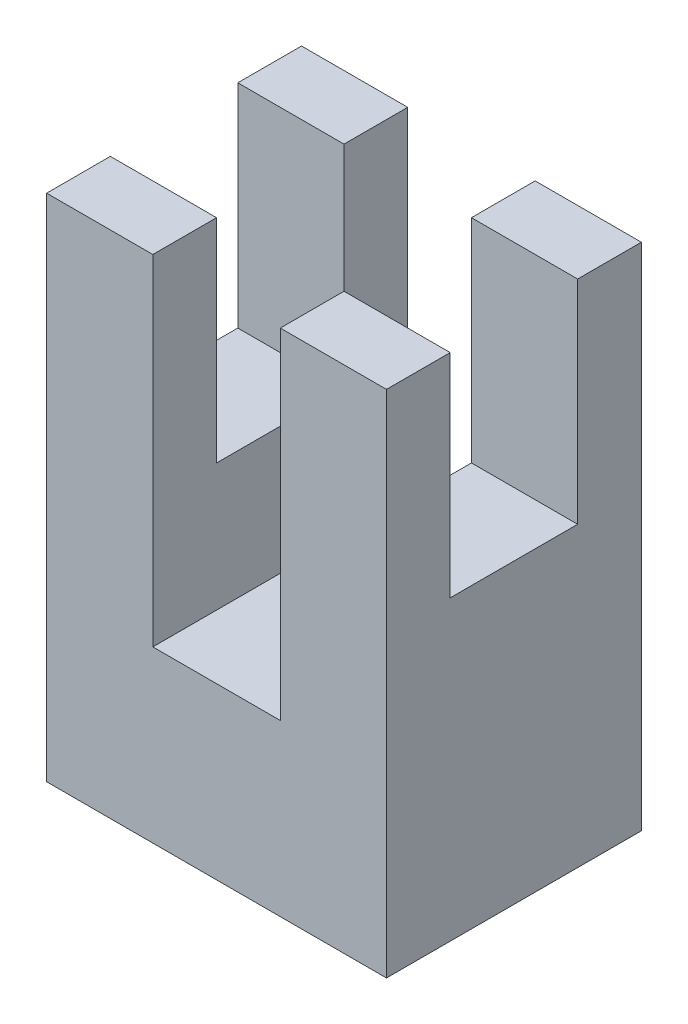
ISO-10303-21;
HEADER;
FILE_DESCRIPTION(('STEP AP214'),'2;1');
FILE_NAME('part.step','',(''),(''),'','','');
FILE_SCHEMA(('AUTOMOTIVE_DESIGN { 1 0 10303 214 1 1 1 1 }'));
ENDSEC;
DATA;
#1=APPLICATION_CONTEXT('core data for automotive mechanical design processes');
#2=APPLICATION_PROTOCOL_DEFINITION('international standard','automotive_design',2000,#1);
#3=PRODUCT_CONTEXT('',#1,'mechanical');
#4=PRODUCT('Part','Part','',(#3));
#5=PRODUCT_RELATED_PRODUCT_CATEGORY('part','',(#4));
#6=PRODUCT_DEFINITION_FORMATION('','',#4);
#7=PRODUCT_DEFINITION_CONTEXT('part definition',#1,'design');
#8=PRODUCT_DEFINITION('design','',#6,#7);
#9=PRODUCT_DEFINITION_SHAPE('','',#8);
#10=(LENGTH_UNIT() NAMED_UNIT(*) SI_UNIT(.MILLI.,.METRE.));
#11=(NAMED_UNIT(*) PLANE_ANGLE_UNIT() SI_UNIT($,.RADIAN.));
#12=(NAMED_UNIT(*) SI_UNIT($,.STERADIAN.) SOLID_ANGLE_UNIT());
#13=UNCERTAINTY_MEASURE_WITH_UNIT(LENGTH_MEASURE(1.E-05),#10,'distance_accuracy_value','');
#14=(GEOMETRIC_REPRESENTATION_CONTEXT(3) GLOBAL_UNCERTAINTY_ASSIGNED_CONTEXT((#13)) GLOBAL_UNIT_ASSIGNED_CONTEXT((#10,
#11,#12)) REPRESENTATION_CONTEXT('',''));
#15=CARTESIAN_POINT('',(0.,0.,0.));
#16=DIRECTION('',(0.,0.,1.));
#17=DIRECTION('',(1.,0.,0.));
#18=AXIS2_PLACEMENT_3D('',#15,#16,#17);
#19=CARTESIAN_POINT('',(-20.,60.,15.));
#20=DIRECTION('',(1.,0.,0.));
#21=DIRECTION('',(0.,1.,0.));
#22=AXIS2_PLACEMENT_3D('',#19,#20,#21);
#23=PLANE('',#22);
#24=DIRECTION('',(0.,-1.,0.));
#25=VECTOR('',#24,1.);
#26=CARTESIAN_POINT('',(-20.,60.,7.5));
#27=LINE('',#26,#25);
#28=CARTESIAN_POINT('',(-20.,60.,7.5));
#29=VERTEX_POINT('',#28);
#30=CARTESIAN_POINT('',(-20.,35.,7.5));
#31=VERTEX_POINT('',#30);
#32=EDGE_CURVE('E150',#29,#31,#27,.T.);
#33=ORIENTED_EDGE('',*,*,#32,.T.);
#34=DIRECTION('',(0.,0.,-1.));
#35=VECTOR('',#34,1.);
#36=CARTESIAN_POINT('',(-20.,35.,7.5));
#37=LINE('',#36,#35);
#38=CARTESIAN_POINT('',(-20.,35.,-7.5));
#39=VERTEX_POINT('',#38);
#40=EDGE_CURVE('E286',#31,#39,#37,.T.);
#41=ORIENTED_EDGE('',*,*,#40,.T.);
#42=DIRECTION('',(0.,1.,0.));
#43=VECTOR('',#42,1.);
#44=CARTESIAN_POINT('',(-20.,35.,-7.5));
#45=LINE('',#44,#43);
#46=CARTESIAN_POINT('',(-20.,60.,-7.5));
#47=VERTEX_POINT('',#46);
#48=EDGE_CURVE('E165',#39,#47,#45,.T.);
#49=ORIENTED_EDGE('',*,*,#48,.T.);
#50=DIRECTION('',(0.,0.,-1.));
#51=VECTOR('',#50,1.);
#52=CARTESIAN_POINT('',(-20.,60.,15.));
#53=LINE('',#52,#51);
#54=CARTESIAN_POINT('',(-20.,60.,-15.));
#55=VERTEX_POINT('',#54);
#56=EDGE_CURVE('E246',#47,#55,#53,.T.);
#57=ORIENTED_EDGE('',*,*,#56,.T.);
#58=DIRECTION('',(0.,-1.,0.));
#59=VECTOR('',#58,1.);
#60=CARTESIAN_POINT('',(-20.,60.,-15.));
#61=LINE('',#60,#59);
#62=CARTESIAN_POINT('',(-20.,0.,-15.));
#63=VERTEX_POINT('',#62);
#64=EDGE_CURVE('E211',#55,#63,#61,.T.);
#65=ORIENTED_EDGE('',*,*,#64,.T.);
#66=DIRECTION('',(0.,0.,-1.));
#67=VECTOR('',#66,1.);
#68=CARTESIAN_POINT('',(-20.,0.,15.));
#69=LINE('',#68,#67);
#70=CARTESIAN_POINT('',(-20.,0.,15.));
#71=VERTEX_POINT('',#70);
#72=EDGE_CURVE('E11',#71,#63,#69,.T.);
#73=ORIENTED_EDGE('',*,*,#72,.F.);
#74=DIRECTION('',(0.,-1.,0.));
#75=VECTOR('',#74,1.);
#76=CARTESIAN_POINT('',(-20.,60.,15.));
#77=LINE('',#76,#75);
#78=CARTESIAN_POINT('',(-20.,60.,15.));
#79=VERTEX_POINT('',#78);
#80=EDGE_CURVE('E222',#79,#71,#77,.T.);
#81=ORIENTED_EDGE('',*,*,#80,.F.);
#82=EDGE_CURVE('E175',#79,#29,#53,.T.);
#83=ORIENTED_EDGE('',*,*,#82,.T.);
#84=EDGE_LOOP('',(#33,#41,#49,#57,#65,#73,#81,#83));
#85=FACE_BOUND('',#84,.T.);
#86=ADVANCED_FACE('F32',(#85),#23,.F.);
#87=CARTESIAN_POINT('',(-7.5,20.,15.));
#88=DIRECTION('',(-1.,0.,0.));
#89=DIRECTION('',(0.,0.,1.));
#90=AXIS2_PLACEMENT_3D('',#87,#88,#89);
#91=PLANE('',#90);
#92=DIRECTION('',(0.,1.,0.));
#93=VECTOR('',#92,1.);
#94=CARTESIAN_POINT('',(-7.5,60.,7.5));
#95=LINE('',#94,#93);
#96=CARTESIAN_POINT('',(-7.5,35.,7.5));
#97=VERTEX_POINT('',#96);
#98=CARTESIAN_POINT('',(-7.5,60.,7.5));
#99=VERTEX_POINT('',#98);
#100=EDGE_CURVE('E147',#97,#99,#95,.T.);
#101=ORIENTED_EDGE('',*,*,#100,.T.);
#102=DIRECTION('',(0.,0.,-1.));
#103=VECTOR('',#102,1.);
#104=CARTESIAN_POINT('',(-7.5,60.,15.));
#105=LINE('',#104,#103);
#106=CARTESIAN_POINT('',(-7.5,60.,15.));
#107=VERTEX_POINT('',#106);
#108=EDGE_CURVE('E162',#107,#99,#105,.T.);
#109=ORIENTED_EDGE('',*,*,#108,.F.);
#110=DIRECTION('',(0.,1.,0.));
#111=VECTOR('',#110,1.);
#112=CARTESIAN_POINT('',(-7.5,20.,15.));
#113=LINE('',#112,#111);
#114=CARTESIAN_POINT('',(-7.5,20.,15.));
#115=VERTEX_POINT('',#114);
#116=EDGE_CURVE('E244',#115,#107,#113,.T.);
#117=ORIENTED_EDGE('',*,*,#116,.F.);
#118=DIRECTION('',(0.,0.,-1.));
#119=VECTOR('',#118,1.);
#120=CARTESIAN_POINT('',(-7.5,20.,15.));
#121=LINE('',#120,#119);
#122=CARTESIAN_POINT('',(-7.5,20.,-15.));
#123=VERTEX_POINT('',#122);
#124=EDGE_CURVE('E169',#115,#123,#121,.T.);
#125=ORIENTED_EDGE('',*,*,#124,.T.);
#126=DIRECTION('',(0.,1.,0.));
#127=VECTOR('',#126,1.);
#128=CARTESIAN_POINT('',(-7.5,20.,-15.));
#129=LINE('',#128,#127);
#130=CARTESIAN_POINT('',(-7.5,60.,-15.));
#131=VERTEX_POINT('',#130);
#132=EDGE_CURVE('E218',#123,#131,#129,.T.);
#133=ORIENTED_EDGE('',*,*,#132,.T.);
#134=CARTESIAN_POINT('',(-7.5,60.,-7.5));
#135=VERTEX_POINT('',#134);
#136=EDGE_CURVE('E170',#135,#131,#105,.T.);
#137=ORIENTED_EDGE('',*,*,#136,.F.);
#138=DIRECTION('',(0.,-1.,0.));
#139=VECTOR('',#138,1.);
#140=CARTESIAN_POINT('',(-7.5,35.,-7.5));
#141=LINE('',#140,#139);
#142=CARTESIAN_POINT('',(-7.5,35.,-7.5));
#143=VERTEX_POINT('',#142);
#144=EDGE_CURVE('E46',#135,#143,#141,.T.);
#145=ORIENTED_EDGE('',*,*,#144,.T.);
#146=DIRECTION('',(0.,0.,1.));
#147=VECTOR('',#146,1.);
#148=CARTESIAN_POINT('',(-7.5,35.,7.5));
#149=LINE('',#148,#147);
#150=EDGE_CURVE('E164',#143,#97,#149,.T.);
#151=ORIENTED_EDGE('',*,*,#150,.T.);
#152=EDGE_LOOP('',(#101,#109,#117,#125,#133,#137,#145,#151));
#153=FACE_BOUND('',#152,.T.);
#154=ADVANCED_FACE('F160',(#153),#91,.F.);
#155=CARTESIAN_POINT('',(-7.5,60.,15.));
#156=DIRECTION('',(0.,-1.,0.));
#157=DIRECTION('',(0.,0.,-1.));
#158=AXIS2_PLACEMENT_3D('',#155,#156,#157);
#159=PLANE('',#158);
#160=DIRECTION('',(-1.,0.,0.));
#161=VECTOR('',#160,1.);
#162=CARTESIAN_POINT('',(20.001,60.,7.5));
#163=LINE('',#162,#161);
#164=EDGE_CURVE('E144',#99,#29,#163,.T.);
#165=ORIENTED_EDGE('',*,*,#164,.T.);
#166=ORIENTED_EDGE('',*,*,#82,.F.);
#167=DIRECTION('',(-1.,0.,0.));
#168=VECTOR('',#167,1.);
#169=CARTESIAN_POINT('',(-7.5,60.,15.));
#170=LINE('',#169,#168);
#171=EDGE_CURVE('E168',#107,#79,#170,.T.);
#172=ORIENTED_EDGE('',*,*,#171,.F.);
#173=ORIENTED_EDGE('',*,*,#108,.T.);
#174=EDGE_LOOP('',(#165,#166,#172,#173));
#175=FACE_BOUND('',#174,.T.);
#176=ADVANCED_FACE('F167',(#175),#159,.F.);
#177=DIRECTION('',(-1.,0.,0.));
#178=VECTOR('',#177,1.);
#179=CARTESIAN_POINT('',(20.001,60.,-7.5));
#180=LINE('',#179,#178);
#181=EDGE_CURVE('E280',#135,#47,#180,.T.);
#182=ORIENTED_EDGE('',*,*,#181,.F.);
#183=ORIENTED_EDGE('',*,*,#136,.T.);
#184=DIRECTION('',(-1.,0.,0.));
#185=VECTOR('',#184,1.);
#186=CARTESIAN_POINT('',(-7.5,60.,-15.));
#187=LINE('',#186,#185);
#188=EDGE_CURVE('E220',#131,#55,#187,.T.);
#189=ORIENTED_EDGE('',*,*,#188,.T.);
#190=ORIENTED_EDGE('',*,*,#56,.F.);
#191=EDGE_LOOP('',(#182,#183,#189,#190));
#192=FACE_BOUND('',#191,.T.);
#193=ADVANCED_FACE('F293',(#192),#159,.F.);
#194=CARTESIAN_POINT('',(20.,60.,15.));
#195=DIRECTION('',(0.,-1.,0.));
#196=DIRECTION('',(1.,0.,0.));
#197=AXIS2_PLACEMENT_3D('',#194,#195,#196);
#198=PLANE('',#197);
#199=DIRECTION('',(0.,0.,-1.));
#200=VECTOR('',#199,1.);
#201=CARTESIAN_POINT('',(7.49999999999998,60.,15.));
#202=LINE('',#201,#200);
#203=CARTESIAN_POINT('',(7.49999999999998,60.,-7.5));
#204=VERTEX_POINT('',#203);
#205=CARTESIAN_POINT('',(7.49999999999998,60.,-15.));
#206=VERTEX_POINT('',#205);
#207=EDGE_CURVE('E181',#204,#206,#202,.T.);
#208=ORIENTED_EDGE('',*,*,#207,.F.);
#209=DIRECTION('',(1.,0.,0.));
#210=VECTOR('',#209,1.);
#211=CARTESIAN_POINT('',(-20.001,60.,-7.5));
#212=LINE('',#211,#210);
#213=CARTESIAN_POINT('',(20.,60.,-7.5));
#214=VERTEX_POINT('',#213);
#215=EDGE_CURVE('E249',#204,#214,#212,.T.);
#216=ORIENTED_EDGE('',*,*,#215,.T.);
#217=DIRECTION('',(0.,0.,-1.));
#218=VECTOR('',#217,1.);
#219=CARTESIAN_POINT('',(20.,60.,15.));
#220=LINE('',#219,#218);
#221=CARTESIAN_POINT('',(20.,60.,-15.));
#222=VERTEX_POINT('',#221);
#223=EDGE_CURVE('E185',#214,#222,#220,.T.);
#224=ORIENTED_EDGE('',*,*,#223,.T.);
#225=DIRECTION('',(-1.,0.,0.));
#226=VECTOR('',#225,1.);
#227=CARTESIAN_POINT('',(20.,60.,-15.));
#228=LINE('',#227,#226);
#229=EDGE_CURVE('E207',#222,#206,#228,.T.);
#230=ORIENTED_EDGE('',*,*,#229,.T.);
#231=EDGE_LOOP('',(#208,#216,#224,#230));
#232=FACE_BOUND('',#231,.T.);
#233=ADVANCED_FACE('F312',(#232),#198,.F.);
#234=CARTESIAN_POINT('',(-20.,0.,15.));
#235=DIRECTION('',(0.,1.,0.));
#236=DIRECTION('',(-1.,0.,0.));
#237=AXIS2_PLACEMENT_3D('',#234,#235,#236);
#238=PLANE('',#237);
#239=DIRECTION('',(1.,0.,0.));
#240=VECTOR('',#239,1.);
#241=CARTESIAN_POINT('',(-20.,0.,-15.));
#242=LINE('',#241,#240);
#243=CARTESIAN_POINT('',(20.,0.,-15.));
#244=VERTEX_POINT('',#243);
#245=EDGE_CURVE('E204',#63,#244,#242,.T.);
#246=ORIENTED_EDGE('',*,*,#245,.T.);
#247=DIRECTION('',(0.,0.,-1.));
#248=VECTOR('',#247,1.);
#249=CARTESIAN_POINT('',(20.,0.,15.));
#250=LINE('',#249,#248);
#251=CARTESIAN_POINT('',(20.,0.,15.));
#252=VERTEX_POINT('',#251);
#253=EDGE_CURVE('E39',#252,#244,#250,.T.);
#254=ORIENTED_EDGE('',*,*,#253,.F.);
#255=DIRECTION('',(1.,0.,0.));
#256=VECTOR('',#255,1.);
#257=CARTESIAN_POINT('',(-20.,0.,15.));
#258=LINE('',#257,#256);
#259=EDGE_CURVE('E227',#71,#252,#258,.T.);
#260=ORIENTED_EDGE('',*,*,#259,.F.);
#261=ORIENTED_EDGE('',*,*,#72,.T.);
#262=EDGE_LOOP('',(#246,#254,#260,#261));
#263=FACE_BOUND('',#262,.T.);
#264=ADVANCED_FACE('F295',(#263),#238,.F.);
#265=CARTESIAN_POINT('',(20.,0.,15.));
#266=DIRECTION('',(-1.,0.,0.));
#267=DIRECTION('',(0.,0.,1.));
#268=AXIS2_PLACEMENT_3D('',#265,#266,#267);
#269=PLANE('',#268);
#270=ORIENTED_EDGE('',*,*,#223,.F.);
#271=DIRECTION('',(0.,1.,0.));
#272=VECTOR('',#271,1.);
#273=CARTESIAN_POINT('',(20.,35.,-7.5));
#274=LINE('',#273,#272);
#275=CARTESIAN_POINT('',(20.,35.,-7.5));
#276=VERTEX_POINT('',#275);
#277=EDGE_CURVE('E261',#276,#214,#274,.T.);
#278=ORIENTED_EDGE('',*,*,#277,.F.);
#279=DIRECTION('',(0.,0.,-1.));
#280=VECTOR('',#279,1.);
#281=CARTESIAN_POINT('',(20.,35.,7.5));
#282=LINE('',#281,#280);
#283=CARTESIAN_POINT('',(20.,35.,7.5));
#284=VERTEX_POINT('',#283);
#285=EDGE_CURVE('E267',#284,#276,#282,.T.);
#286=ORIENTED_EDGE('',*,*,#285,.F.);
#287=DIRECTION('',(0.,-1.,0.));
#288=VECTOR('',#287,1.);
#289=CARTESIAN_POINT('',(20.,60.,7.5));
#290=LINE('',#289,#288);
#291=CARTESIAN_POINT('',(20.,60.,7.5));
#292=VERTEX_POINT('',#291);
#293=EDGE_CURVE('E271',#292,#284,#290,.T.);
#294=ORIENTED_EDGE('',*,*,#293,.F.);
#295=CARTESIAN_POINT('',(20.,60.,15.));
#296=VERTEX_POINT('',#295);
#297=EDGE_CURVE('E186',#296,#292,#220,.T.);
#298=ORIENTED_EDGE('',*,*,#297,.F.);
#299=DIRECTION('',(0.,1.,0.));
#300=VECTOR('',#299,1.);
#301=CARTESIAN_POINT('',(20.,0.,15.));
#302=LINE('',#301,#300);
#303=EDGE_CURVE('E199',#252,#296,#302,.T.);
#304=ORIENTED_EDGE('',*,*,#303,.F.);
#305=ORIENTED_EDGE('',*,*,#253,.T.);
#306=DIRECTION('',(0.,1.,0.));
#307=VECTOR('',#306,1.);
#308=CARTESIAN_POINT('',(20.,0.,-15.));
#309=LINE('',#308,#307);
#310=EDGE_CURVE('E196',#244,#222,#309,.T.);
#311=ORIENTED_EDGE('',*,*,#310,.T.);
#312=EDGE_LOOP('',(#270,#278,#286,#294,#298,#304,#305,#311));
#313=FACE_BOUND('',#312,.T.);
#314=ADVANCED_FACE('F195',(#313),#269,.F.);
#315=ORIENTED_EDGE('',*,*,#297,.T.);
#316=DIRECTION('',(1.,0.,0.));
#317=VECTOR('',#316,1.);
#318=CARTESIAN_POINT('',(-20.001,60.,7.5));
#319=LINE('',#318,#317);
#320=CARTESIAN_POINT('',(7.49999999999998,60.,7.5));
#321=VERTEX_POINT('',#320);
#322=EDGE_CURVE('E264',#321,#292,#319,.T.);
#323=ORIENTED_EDGE('',*,*,#322,.F.);
#324=CARTESIAN_POINT('',(7.49999999999998,60.,15.));
#325=VERTEX_POINT('',#324);
#326=EDGE_CURVE('E182',#325,#321,#202,.T.);
#327=ORIENTED_EDGE('',*,*,#326,.F.);
#328=DIRECTION('',(-1.,0.,0.));
#329=VECTOR('',#328,1.);
#330=CARTESIAN_POINT('',(20.,60.,15.));
#331=LINE('',#330,#329);
#332=EDGE_CURVE('E238',#296,#325,#331,.T.);
#333=ORIENTED_EDGE('',*,*,#332,.F.);
#334=EDGE_LOOP('',(#315,#323,#327,#333));
#335=FACE_BOUND('',#334,.T.);
#336=ADVANCED_FACE('F300',(#335),#198,.F.);
#337=CARTESIAN_POINT('',(7.49999999999998,60.,15.));
#338=DIRECTION('',(1.,0.,0.));
#339=DIRECTION('',(0.,1.,0.));
#340=AXIS2_PLACEMENT_3D('',#337,#338,#339);
#341=PLANE('',#340);
#342=DIRECTION('',(0.,0.,1.));
#343=VECTOR('',#342,1.);
#344=CARTESIAN_POINT('',(7.49999999999999,35.,7.5));
#345=LINE('',#344,#343);
#346=CARTESIAN_POINT('',(7.49999999999999,35.,-7.5));
#347=VERTEX_POINT('',#346);
#348=CARTESIAN_POINT('',(7.49999999999999,35.,7.5));
#349=VERTEX_POINT('',#348);
#350=EDGE_CURVE('E54',#347,#349,#345,.T.);
#351=ORIENTED_EDGE('',*,*,#350,.F.);
#352=DIRECTION('',(0.,-1.,0.));
#353=VECTOR('',#352,1.);
#354=CARTESIAN_POINT('',(7.49999999999999,35.,-7.5));
#355=LINE('',#354,#353);
#356=EDGE_CURVE('E273',#204,#347,#355,.T.);
#357=ORIENTED_EDGE('',*,*,#356,.F.);
#358=ORIENTED_EDGE('',*,*,#207,.T.);
#359=DIRECTION('',(0.,-1.,0.));
#360=VECTOR('',#359,1.);
#361=CARTESIAN_POINT('',(7.49999999999998,60.,-15.));
#362=LINE('',#361,#360);
#363=CARTESIAN_POINT('',(7.5,20.,-15.));
#364=VERTEX_POINT('',#363);
#365=EDGE_CURVE('E209',#206,#364,#362,.T.);
#366=ORIENTED_EDGE('',*,*,#365,.T.);
#367=DIRECTION('',(0.,0.,-1.));
#368=VECTOR('',#367,1.);
#369=CARTESIAN_POINT('',(7.5,20.,15.));
#370=LINE('',#369,#368);
#371=CARTESIAN_POINT('',(7.5,20.,15.));
#372=VERTEX_POINT('',#371);
#373=EDGE_CURVE('E173',#372,#364,#370,.T.);
#374=ORIENTED_EDGE('',*,*,#373,.F.);
#375=DIRECTION('',(0.,-1.,0.));
#376=VECTOR('',#375,1.);
#377=CARTESIAN_POINT('',(7.49999999999998,60.,15.));
#378=LINE('',#377,#376);
#379=EDGE_CURVE('E240',#325,#372,#378,.T.);
#380=ORIENTED_EDGE('',*,*,#379,.F.);
#381=ORIENTED_EDGE('',*,*,#326,.T.);
#382=DIRECTION('',(0.,1.,0.));
#383=VECTOR('',#382,1.);
#384=CARTESIAN_POINT('',(7.49999999999998,60.,7.5));
#385=LINE('',#384,#383);
#386=EDGE_CURVE('E234',#349,#321,#385,.T.);
#387=ORIENTED_EDGE('',*,*,#386,.F.);
#388=EDGE_LOOP('',(#351,#357,#358,#366,#374,#380,#381,#387));
#389=FACE_BOUND('',#388,.T.);
#390=ADVANCED_FACE('F304',(#389),#341,.F.);
#391=CARTESIAN_POINT('',(7.5,20.,15.));
#392=DIRECTION('',(0.,-1.,0.));
#393=DIRECTION('',(1.,0.,0.));
#394=AXIS2_PLACEMENT_3D('',#391,#392,#393);
#395=PLANE('',#394);
#396=DIRECTION('',(-1.,0.,0.));
#397=VECTOR('',#396,1.);
#398=CARTESIAN_POINT('',(7.5,20.,-15.));
#399=LINE('',#398,#397);
#400=EDGE_CURVE('E216',#364,#123,#399,.T.);
#401=ORIENTED_EDGE('',*,*,#400,.T.);
#402=ORIENTED_EDGE('',*,*,#124,.F.);
#403=DIRECTION('',(-1.,0.,0.));
#404=VECTOR('',#403,1.);
#405=CARTESIAN_POINT('',(7.5,20.,15.));
#406=LINE('',#405,#404);
#407=EDGE_CURVE('E242',#372,#115,#406,.T.);
#408=ORIENTED_EDGE('',*,*,#407,.F.);
#409=ORIENTED_EDGE('',*,*,#373,.T.);
#410=EDGE_LOOP('',(#401,#402,#408,#409));
#411=FACE_BOUND('',#410,.T.);
#412=ADVANCED_FACE('F308',(#411),#395,.F.);
#413=CARTESIAN_POINT('',(0.,0.,15.));
#414=DIRECTION('',(0.,0.,1.));
#415=DIRECTION('',(1.,0.,0.));
#416=AXIS2_PLACEMENT_3D('',#413,#414,#415);
#417=PLANE('',#416);
#418=ORIENTED_EDGE('',*,*,#80,.T.);
#419=ORIENTED_EDGE('',*,*,#259,.T.);
#420=ORIENTED_EDGE('',*,*,#303,.T.);
#421=ORIENTED_EDGE('',*,*,#332,.T.);
#422=ORIENTED_EDGE('',*,*,#379,.T.);
#423=ORIENTED_EDGE('',*,*,#407,.T.);
#424=ORIENTED_EDGE('',*,*,#116,.T.);
#425=ORIENTED_EDGE('',*,*,#171,.T.);
#426=EDGE_LOOP('',(#418,#419,#420,#421,#422,#423,#424,#425));
#427=FACE_BOUND('',#426,.T.);
#428=ADVANCED_FACE('F296',(#427),#417,.T.);
#429=CARTESIAN_POINT('',(0.,0.,-15.));
#430=DIRECTION('',(0.,0.,1.));
#431=DIRECTION('',(1.,0.,0.));
#432=AXIS2_PLACEMENT_3D('',#429,#430,#431);
#433=PLANE('',#432);
#434=ORIENTED_EDGE('',*,*,#64,.F.);
#435=ORIENTED_EDGE('',*,*,#188,.F.);
#436=ORIENTED_EDGE('',*,*,#132,.F.);
#437=ORIENTED_EDGE('',*,*,#400,.F.);
#438=ORIENTED_EDGE('',*,*,#365,.F.);
#439=ORIENTED_EDGE('',*,*,#229,.F.);
#440=ORIENTED_EDGE('',*,*,#310,.F.);
#441=ORIENTED_EDGE('',*,*,#245,.F.);
#442=EDGE_LOOP('',(#434,#435,#436,#437,#438,#439,#440,#441));
#443=FACE_BOUND('',#442,.T.);
#444=ADVANCED_FACE('F203',(#443),#433,.F.);
#445=CARTESIAN_POINT('',(-20.001,35.,-7.5));
#446=DIRECTION('',(0.,0.,-1.));
#447=DIRECTION('',(0.,1.,0.));
#448=AXIS2_PLACEMENT_3D('',#445,#446,#447);
#449=PLANE('',#448);
#450=ORIENTED_EDGE('',*,*,#356,.T.);
#451=DIRECTION('',(1.,0.,0.));
#452=VECTOR('',#451,1.);
#453=CARTESIAN_POINT('',(-20.001,35.,-7.5));
#454=LINE('',#453,#452);
#455=EDGE_CURVE('E254',#347,#276,#454,.T.);
#456=ORIENTED_EDGE('',*,*,#455,.T.);
#457=ORIENTED_EDGE('',*,*,#277,.T.);
#458=ORIENTED_EDGE('',*,*,#215,.F.);
#459=EDGE_LOOP('',(#450,#456,#457,#458));
#460=FACE_BOUND('',#459,.T.);
#461=ADVANCED_FACE('F358',(#460),#449,.F.);
#462=CARTESIAN_POINT('',(-20.001,35.,7.5));
#463=DIRECTION('',(0.,-1.,0.));
#464=DIRECTION('',(0.,0.,-1.));
#465=AXIS2_PLACEMENT_3D('',#462,#463,#464);
#466=PLANE('',#465);
#467=ORIENTED_EDGE('',*,*,#350,.T.);
#468=DIRECTION('',(1.,0.,0.));
#469=VECTOR('',#468,1.);
#470=CARTESIAN_POINT('',(-20.001,35.,7.5));
#471=LINE('',#470,#469);
#472=EDGE_CURVE('E258',#349,#284,#471,.T.);
#473=ORIENTED_EDGE('',*,*,#472,.T.);
#474=ORIENTED_EDGE('',*,*,#285,.T.);
#475=ORIENTED_EDGE('',*,*,#455,.F.);
#476=EDGE_LOOP('',(#467,#473,#474,#475));
#477=FACE_BOUND('',#476,.T.);
#478=ADVANCED_FACE('F363',(#477),#466,.F.);
#479=CARTESIAN_POINT('',(-20.001,60.,7.5));
#480=DIRECTION('',(0.,0.,1.));
#481=DIRECTION('',(0.,-1.,0.));
#482=AXIS2_PLACEMENT_3D('',#479,#480,#481);
#483=PLANE('',#482);
#484=ORIENTED_EDGE('',*,*,#386,.T.);
#485=ORIENTED_EDGE('',*,*,#322,.T.);
#486=ORIENTED_EDGE('',*,*,#293,.T.);
#487=ORIENTED_EDGE('',*,*,#472,.F.);
#488=EDGE_LOOP('',(#484,#485,#486,#487));
#489=FACE_BOUND('',#488,.T.);
#490=ADVANCED_FACE('F370',(#489),#483,.F.);
#491=CARTESIAN_POINT('',(20.001,60.,7.5));
#492=DIRECTION('',(0.,0.,-1.));
#493=DIRECTION('',(0.,1.,0.));
#494=AXIS2_PLACEMENT_3D('',#491,#492,#493);
#495=PLANE('',#494);
#496=DIRECTION('',(-1.,0.,0.));
#497=VECTOR('',#496,1.);
#498=CARTESIAN_POINT('',(20.001,35.,7.5));
#499=LINE('',#498,#497);
#500=EDGE_CURVE('E155',#97,#31,#499,.T.);
#501=ORIENTED_EDGE('',*,*,#500,.T.);
#502=ORIENTED_EDGE('',*,*,#32,.F.);
#503=ORIENTED_EDGE('',*,*,#164,.F.);
#504=ORIENTED_EDGE('',*,*,#100,.F.);
#505=EDGE_LOOP('',(#501,#502,#503,#504));
#506=FACE_BOUND('',#505,.T.);
#507=ADVANCED_FACE('F146',(#506),#495,.T.);
#508=CARTESIAN_POINT('',(20.001,35.,7.5));
#509=DIRECTION('',(0.,1.,0.));
#510=DIRECTION('',(0.,0.,1.));
#511=AXIS2_PLACEMENT_3D('',#508,#509,#510);
#512=PLANE('',#511);
#513=DIRECTION('',(-1.,0.,0.));
#514=VECTOR('',#513,1.);
#515=CARTESIAN_POINT('',(20.001,35.,-7.5));
#516=LINE('',#515,#514);
#517=EDGE_CURVE('E282',#143,#39,#516,.T.);
#518=ORIENTED_EDGE('',*,*,#517,.T.);
#519=ORIENTED_EDGE('',*,*,#40,.F.);
#520=ORIENTED_EDGE('',*,*,#500,.F.);
#521=ORIENTED_EDGE('',*,*,#150,.F.);
#522=EDGE_LOOP('',(#518,#519,#520,#521));
#523=FACE_BOUND('',#522,.T.);
#524=ADVANCED_FACE('F383',(#523),#512,.T.);
#525=CARTESIAN_POINT('',(20.001,35.,-7.5));
#526=DIRECTION('',(0.,0.,1.));
#527=DIRECTION('',(0.,-1.,0.));
#528=AXIS2_PLACEMENT_3D('',#525,#526,#527);
#529=PLANE('',#528);
#530=ORIENTED_EDGE('',*,*,#181,.T.);
#531=ORIENTED_EDGE('',*,*,#48,.F.);
#532=ORIENTED_EDGE('',*,*,#517,.F.);
#533=ORIENTED_EDGE('',*,*,#144,.F.);
#534=EDGE_LOOP('',(#530,#531,#532,#533));
#535=FACE_BOUND('',#534,.T.);
#536=ADVANCED_FACE('F391',(#535),#529,.T.);
#537=CLOSED_SHELL('',(#86,#154,#176,#193,#233,#264,#314,#336,#390,#412,#428,#444,#461,#478,#490,
#507,#524,#536));
#538=MANIFOLD_SOLID_BREP('B2',#537);
#539=ADVANCED_BREP_SHAPE_REPRESENTATION('',(#18,#538),#14);
#540=SHAPE_DEFINITION_REPRESENTATION(#9,#539);
ENDSEC;
END-ISO-10303-21;
